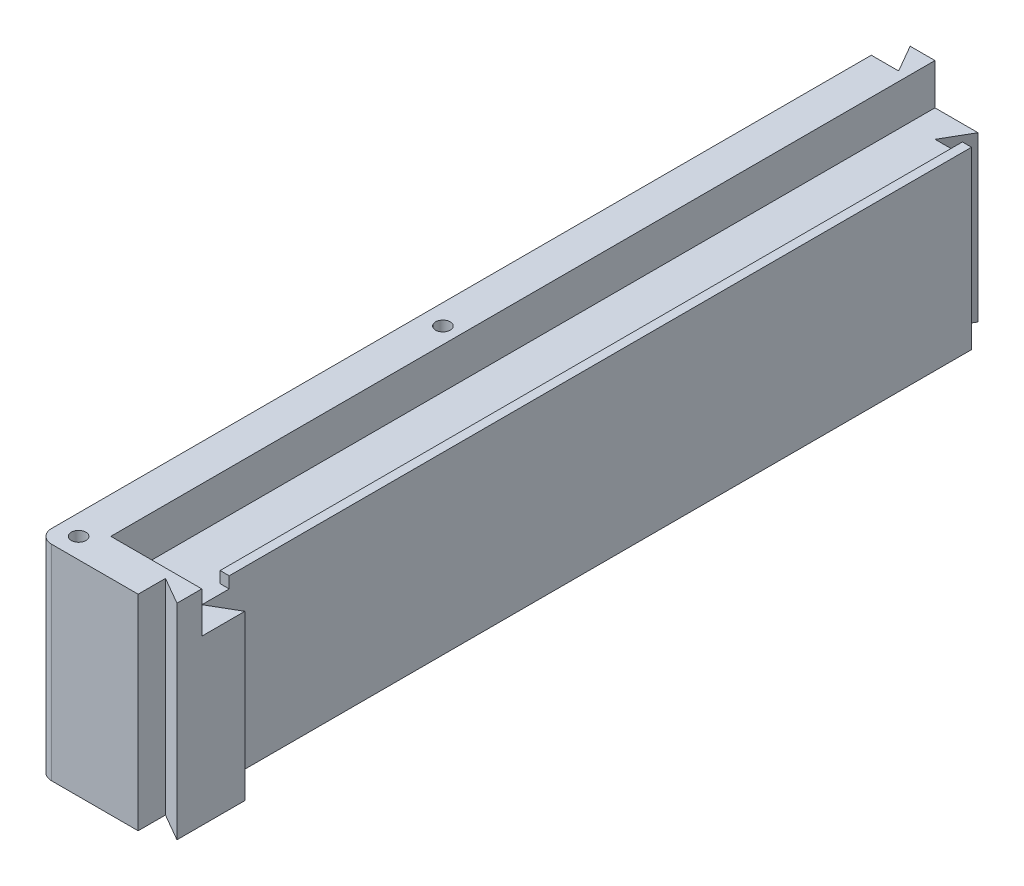
ISO-10303-21;
HEADER;
FILE_DESCRIPTION(('STEP AP214'),'2;1');
FILE_NAME('part.step','',(''),(''),'','','');
FILE_SCHEMA(('AUTOMOTIVE_DESIGN { 1 0 10303 214 1 1 1 1 }'));
ENDSEC;
DATA;
#1=APPLICATION_CONTEXT('core data for automotive mechanical design processes');
#2=APPLICATION_PROTOCOL_DEFINITION('international standard','automotive_design',2000,#1);
#3=PRODUCT_CONTEXT('',#1,'mechanical');
#4=PRODUCT('Part','Part','',(#3));
#5=PRODUCT_RELATED_PRODUCT_CATEGORY('part','',(#4));
#6=PRODUCT_DEFINITION_FORMATION('','',#4);
#7=PRODUCT_DEFINITION_CONTEXT('part definition',#1,'design');
#8=PRODUCT_DEFINITION('design','',#6,#7);
#9=PRODUCT_DEFINITION_SHAPE('','',#8);
#10=(LENGTH_UNIT() NAMED_UNIT(*) SI_UNIT(.MILLI.,.METRE.));
#11=(NAMED_UNIT(*) PLANE_ANGLE_UNIT() SI_UNIT($,.RADIAN.));
#12=(NAMED_UNIT(*) SI_UNIT($,.STERADIAN.) SOLID_ANGLE_UNIT());
#13=UNCERTAINTY_MEASURE_WITH_UNIT(LENGTH_MEASURE(1.E-05),#10,'distance_accuracy_value','');
#14=(GEOMETRIC_REPRESENTATION_CONTEXT(3) GLOBAL_UNCERTAINTY_ASSIGNED_CONTEXT((#13)) GLOBAL_UNIT_ASSIGNED_CONTEXT((#10,
#11,#12)) REPRESENTATION_CONTEXT('',''));
#15=CARTESIAN_POINT('',(0.,0.,0.));
#16=DIRECTION('',(0.,0.,1.));
#17=DIRECTION('',(1.,0.,0.));
#18=AXIS2_PLACEMENT_3D('',#15,#16,#17);
#19=CARTESIAN_POINT('',(0.,0.,0.));
#20=DIRECTION('',(0.,1.,0.));
#21=DIRECTION('',(0.,0.,1.));
#22=AXIS2_PLACEMENT_3D('',#19,#20,#21);
#23=PLANE('',#22);
#24=CARTESIAN_POINT('',(-3.53553390593275,0.,3.53553390593275));
#25=DIRECTION('',(0.,1.,0.));
#26=DIRECTION('',(0.,0.,1.));
#27=AXIS2_PLACEMENT_3D('',#24,#25,#26);
#28=CIRCLE('',#27,1.6);
#29=CARTESIAN_POINT('',(-3.53553390593275,0.,5.13553390593275));
#30=VERTEX_POINT('',#29);
#31=EDGE_CURVE('E231',#30,#30,#28,.F.);
#32=ORIENTED_EDGE('',*,*,#31,.F.);
#33=EDGE_LOOP('',(#32));
#34=FACE_BOUND('',#33,.T.);
#35=CARTESIAN_POINT('',(-3.53553390593275,0.,-76.4644660940672));
#36=DIRECTION('',(0.,1.,0.));
#37=DIRECTION('',(0.,0.,1.));
#38=AXIS2_PLACEMENT_3D('',#35,#36,#37);
#39=CIRCLE('',#38,1.60000000000001);
#40=CARTESIAN_POINT('',(-3.53553390593275,0.,-74.8644660940672));
#41=VERTEX_POINT('',#40);
#42=EDGE_CURVE('E328',#41,#41,#39,.T.);
#43=ORIENTED_EDGE('',*,*,#42,.T.);
#44=EDGE_LOOP('',(#43));
#45=FACE_BOUND('',#44,.T.);
#46=DIRECTION('',(1.,0.,0.));
#47=VECTOR('',#46,1.);
#48=CARTESIAN_POINT('',(0.,0.,8.));
#49=LINE('',#48,#47);
#50=CARTESIAN_POINT('',(-5.,0.,8.));
#51=VERTEX_POINT('',#50);
#52=CARTESIAN_POINT('',(14.,0.,8.));
#53=VERTEX_POINT('',#52);
#54=EDGE_CURVE('E56',#51,#53,#49,.T.);
#55=ORIENTED_EDGE('',*,*,#54,.F.);
#56=CARTESIAN_POINT('',(-5.,0.,5.));
#57=DIRECTION('',(0.,1.,0.));
#58=DIRECTION('',(0.,0.,1.));
#59=AXIS2_PLACEMENT_3D('',#56,#57,#58);
#60=CIRCLE('',#59,3.);
#61=CARTESIAN_POINT('',(-8.,0.,5.));
#62=VERTEX_POINT('',#61);
#63=EDGE_CURVE('E331',#62,#51,#60,.T.);
#64=ORIENTED_EDGE('',*,*,#63,.F.);
#65=DIRECTION('',(0.,0.,1.));
#66=VECTOR('',#65,1.);
#67=CARTESIAN_POINT('',(-8.,0.,0.));
#68=LINE('',#67,#66);
#69=CARTESIAN_POINT('',(-8.,0.,-175.));
#70=VERTEX_POINT('',#69);
#71=EDGE_CURVE('E78',#70,#62,#68,.T.);
#72=ORIENTED_EDGE('',*,*,#71,.F.);
#73=DIRECTION('',(-1.,0.,0.));
#74=VECTOR('',#73,1.);
#75=CARTESIAN_POINT('',(-6.07153216591882E-13,0.,-175.));
#76=LINE('',#75,#74);
#77=CARTESIAN_POINT('',(-1.99999999999997,0.,-175.));
#78=VERTEX_POINT('',#77);
#79=EDGE_CURVE('E367',#78,#70,#76,.T.);
#80=ORIENTED_EDGE('',*,*,#79,.F.);
#81=DIRECTION('',(-0.499999999999998,0.,-0.86602540378444));
#82=VECTOR('',#81,1.);
#83=CARTESIAN_POINT('',(74.2772228311382,0.,-42.8839745962152));
#84=LINE('',#83,#82);
#85=CARTESIAN_POINT('',(-5.45,0.,-180.975575286113));
#86=VERTEX_POINT('',#85);
#87=EDGE_CURVE('E364',#78,#86,#84,.T.);
#88=ORIENTED_EDGE('',*,*,#87,.T.);
#89=DIRECTION('',(1.,0.,0.));
#90=VECTOR('',#89,1.);
#91=CARTESIAN_POINT('',(0.,0.,-180.975575286113));
#92=LINE('',#91,#90);
#93=CARTESIAN_POINT('',(9.45000000000001,0.,-180.975575286113));
#94=VERTEX_POINT('',#93);
#95=EDGE_CURVE('E361',#86,#94,#92,.T.);
#96=ORIENTED_EDGE('',*,*,#95,.T.);
#97=DIRECTION('',(-0.499999999999998,0.,0.86602540378444));
#98=VECTOR('',#97,1.);
#99=CARTESIAN_POINT('',(-71.2772228311381,0.,-41.1519237886463));
#100=LINE('',#99,#98);
#101=CARTESIAN_POINT('',(6.00000000000001,0.,-175.));
#102=VERTEX_POINT('',#101);
#103=EDGE_CURVE('E359',#94,#102,#100,.T.);
#104=ORIENTED_EDGE('',*,*,#103,.T.);
#105=CARTESIAN_POINT('',(14.,0.,-175.));
#106=VERTEX_POINT('',#105);
#107=EDGE_CURVE('E263',#106,#102,#76,.T.);
#108=ORIENTED_EDGE('',*,*,#107,.F.);
#109=DIRECTION('',(0.,0.,-1.));
#110=VECTOR('',#109,1.);
#111=CARTESIAN_POINT('',(14.,0.,-336.));
#112=LINE('',#111,#110);
#113=CARTESIAN_POINT('',(14.,0.,-6.));
#114=VERTEX_POINT('',#113);
#115=EDGE_CURVE('E305',#114,#106,#112,.T.);
#116=ORIENTED_EDGE('',*,*,#115,.F.);
#117=DIRECTION('',(-0.86602540378444,0.,0.499999999999997));
#118=VECTOR('',#117,1.);
#119=CARTESIAN_POINT('',(0.901923788646655,0.,1.56217782649103));
#120=LINE('',#119,#118);
#121=CARTESIAN_POINT('',(19.9755752861127,0.,-9.45));
#122=VERTEX_POINT('',#121);
#123=EDGE_CURVE('E272',#122,#114,#120,.T.);
#124=ORIENTED_EDGE('',*,*,#123,.F.);
#125=DIRECTION('',(0.,0.,-1.));
#126=VECTOR('',#125,1.);
#127=CARTESIAN_POINT('',(19.9755752861127,0.,0.));
#128=LINE('',#127,#126);
#129=CARTESIAN_POINT('',(19.9755752861127,0.,5.45000000000001));
#130=VERTEX_POINT('',#129);
#131=EDGE_CURVE('E183',#130,#122,#128,.T.);
#132=ORIENTED_EDGE('',*,*,#131,.F.);
#133=DIRECTION('',(0.86602540378444,0.,0.499999999999998));
#134=VECTOR('',#133,1.);
#135=CARTESIAN_POINT('',(2.63397459621554,0.,-4.56217782649105));
#136=LINE('',#135,#134);
#137=CARTESIAN_POINT('',(14.,0.,2.));
#138=VERTEX_POINT('',#137);
#139=EDGE_CURVE('E371',#138,#130,#136,.T.);
#140=ORIENTED_EDGE('',*,*,#139,.F.);
#141=DIRECTION('',(0.,0.,1.));
#142=VECTOR('',#141,1.);
#143=CARTESIAN_POINT('',(14.,0.,0.));
#144=LINE('',#143,#142);
#145=EDGE_CURVE('E334',#138,#53,#144,.T.);
#146=ORIENTED_EDGE('',*,*,#145,.T.);
#147=EDGE_LOOP('',(#55,#64,#72,#80,#88,#96,#104,#108,#116,#124,#132,#140,#146));
#148=FACE_BOUND('',#147,.T.);
#149=ADVANCED_FACE('F39',(#34,#45,#148),#23,.F.);
#150=CARTESIAN_POINT('',(0.,45.,0.));
#151=DIRECTION('',(0.,1.,0.));
#152=DIRECTION('',(0.,0.,1.));
#153=AXIS2_PLACEMENT_3D('',#150,#151,#152);
#154=PLANE('',#153);
#155=CARTESIAN_POINT('',(-3.53553390593275,45.,-76.4644660940672));
#156=DIRECTION('',(0.,1.,0.));
#157=DIRECTION('',(0.,0.,1.));
#158=AXIS2_PLACEMENT_3D('',#155,#156,#157);
#159=CIRCLE('',#158,1.60000000000001);
#160=CARTESIAN_POINT('',(-3.53553390593275,45.,-74.8644660940672));
#161=VERTEX_POINT('',#160);
#162=EDGE_CURVE('E355',#161,#161,#159,.T.);
#163=ORIENTED_EDGE('',*,*,#162,.F.);
#164=EDGE_LOOP('',(#163));
#165=FACE_BOUND('',#164,.T.);
#166=CARTESIAN_POINT('',(-3.53553390593275,45.,3.53553390593275));
#167=DIRECTION('',(0.,1.,0.));
#168=DIRECTION('',(0.,0.,1.));
#169=AXIS2_PLACEMENT_3D('',#166,#167,#168);
#170=CIRCLE('',#169,1.6);
#171=CARTESIAN_POINT('',(-3.53553390593275,45.,5.13553390593275));
#172=VERTEX_POINT('',#171);
#173=EDGE_CURVE('E228',#172,#172,#170,.F.);
#174=ORIENTED_EDGE('',*,*,#173,.T.);
#175=EDGE_LOOP('',(#174));
#176=FACE_BOUND('',#175,.T.);
#177=CARTESIAN_POINT('',(-5.,45.,5.));
#178=DIRECTION('',(0.,1.,0.));
#179=DIRECTION('',(0.,0.,1.));
#180=AXIS2_PLACEMENT_3D('',#177,#178,#179);
#181=CIRCLE('',#180,3.);
#182=CARTESIAN_POINT('',(-8.,45.,5.));
#183=VERTEX_POINT('',#182);
#184=CARTESIAN_POINT('',(-5.,45.,8.));
#185=VERTEX_POINT('',#184);
#186=EDGE_CURVE('E11',#183,#185,#181,.T.);
#187=ORIENTED_EDGE('',*,*,#186,.T.);
#188=DIRECTION('',(1.,0.,0.));
#189=VECTOR('',#188,1.);
#190=CARTESIAN_POINT('',(0.,45.,8.));
#191=LINE('',#190,#189);
#192=CARTESIAN_POINT('',(14.,45.,8.));
#193=VERTEX_POINT('',#192);
#194=EDGE_CURVE('E71',#185,#193,#191,.T.);
#195=ORIENTED_EDGE('',*,*,#194,.T.);
#196=DIRECTION('',(0.,0.,-1.));
#197=VECTOR('',#196,1.);
#198=CARTESIAN_POINT('',(14.,45.,0.));
#199=LINE('',#198,#197);
#200=CARTESIAN_POINT('',(14.,45.,2.));
#201=VERTEX_POINT('',#200);
#202=EDGE_CURVE('E298',#193,#201,#199,.T.);
#203=ORIENTED_EDGE('',*,*,#202,.T.);
#204=DIRECTION('',(-0.86602540378444,0.,-0.499999999999998));
#205=VECTOR('',#204,1.);
#206=CARTESIAN_POINT('',(2.63397459621554,45.,-4.56217782649105));
#207=LINE('',#206,#205);
#208=CARTESIAN_POINT('',(19.9755752861127,45.,5.45000000000001));
#209=VERTEX_POINT('',#208);
#210=EDGE_CURVE('E303',#209,#201,#207,.T.);
#211=ORIENTED_EDGE('',*,*,#210,.F.);
#212=DIRECTION('',(0.,0.,1.));
#213=VECTOR('',#212,1.);
#214=CARTESIAN_POINT('',(19.9755752861127,45.,0.));
#215=LINE('',#214,#213);
#216=CARTESIAN_POINT('',(19.9755752861127,45.,0.));
#217=VERTEX_POINT('',#216);
#218=EDGE_CURVE('E288',#217,#209,#215,.T.);
#219=ORIENTED_EDGE('',*,*,#218,.F.);
#220=DIRECTION('',(1.,0.,0.));
#221=VECTOR('',#220,1.);
#222=CARTESIAN_POINT('',(0.,45.,0.));
#223=LINE('',#222,#221);
#224=CARTESIAN_POINT('',(0.,45.,0.));
#225=VERTEX_POINT('',#224);
#226=EDGE_CURVE('E236',#225,#217,#223,.T.);
#227=ORIENTED_EDGE('',*,*,#226,.F.);
#228=DIRECTION('',(0.,0.,-1.));
#229=VECTOR('',#228,1.);
#230=CARTESIAN_POINT('',(0.,45.,0.));
#231=LINE('',#230,#229);
#232=CARTESIAN_POINT('',(0.,45.,-180.975575286113));
#233=VERTEX_POINT('',#232);
#234=EDGE_CURVE('E239',#225,#233,#231,.T.);
#235=ORIENTED_EDGE('',*,*,#234,.T.);
#236=DIRECTION('',(-1.,0.,0.));
#237=VECTOR('',#236,1.);
#238=CARTESIAN_POINT('',(0.,45.,-180.975575286113));
#239=LINE('',#238,#237);
#240=CARTESIAN_POINT('',(-5.45,45.,-180.975575286113));
#241=VERTEX_POINT('',#240);
#242=EDGE_CURVE('E268',#233,#241,#239,.T.);
#243=ORIENTED_EDGE('',*,*,#242,.T.);
#244=DIRECTION('',(0.499999999999998,0.,0.86602540378444));
#245=VECTOR('',#244,1.);
#246=CARTESIAN_POINT('',(74.2772228311382,45.,-42.8839745962152));
#247=LINE('',#246,#245);
#248=CARTESIAN_POINT('',(-1.99999999999997,45.,-175.));
#249=VERTEX_POINT('',#248);
#250=EDGE_CURVE('E300',#241,#249,#247,.T.);
#251=ORIENTED_EDGE('',*,*,#250,.T.);
#252=DIRECTION('',(1.,0.,0.));
#253=VECTOR('',#252,1.);
#254=CARTESIAN_POINT('',(-6.07153216591882E-13,45.,-175.));
#255=LINE('',#254,#253);
#256=CARTESIAN_POINT('',(-8.,45.,-175.));
#257=VERTEX_POINT('',#256);
#258=EDGE_CURVE('E296',#257,#249,#255,.T.);
#259=ORIENTED_EDGE('',*,*,#258,.F.);
#260=DIRECTION('',(0.,0.,1.));
#261=VECTOR('',#260,1.);
#262=CARTESIAN_POINT('',(-8.,45.,0.));
#263=LINE('',#262,#261);
#264=EDGE_CURVE('E349',#257,#183,#263,.T.);
#265=ORIENTED_EDGE('',*,*,#264,.T.);
#266=EDGE_LOOP('',(#187,#195,#203,#211,#219,#227,#235,#243,#251,#259,#265));
#267=FACE_BOUND('',#266,.T.);
#268=ADVANCED_FACE('F311',(#165,#176,#267),#154,.T.);
#269=CARTESIAN_POINT('',(-6.07153216591882E-13,126.5,-175.));
#270=DIRECTION('',(0.,0.,1.));
#271=DIRECTION('',(1.,0.,0.));
#272=AXIS2_PLACEMENT_3D('',#269,#270,#271);
#273=PLANE('',#272);
#274=DIRECTION('',(0.,1.,0.));
#275=VECTOR('',#274,1.);
#276=CARTESIAN_POINT('',(-8.,0.,-175.));
#277=LINE('',#276,#275);
#278=EDGE_CURVE('E337',#70,#257,#277,.T.);
#279=ORIENTED_EDGE('',*,*,#278,.T.);
#280=ORIENTED_EDGE('',*,*,#258,.T.);
#281=DIRECTION('',(0.,-1.,0.));
#282=VECTOR('',#281,1.);
#283=CARTESIAN_POINT('',(-1.99999999999997,126.5,-175.));
#284=LINE('',#283,#282);
#285=EDGE_CURVE('E279',#249,#78,#284,.T.);
#286=ORIENTED_EDGE('',*,*,#285,.T.);
#287=ORIENTED_EDGE('',*,*,#79,.T.);
#288=EDGE_LOOP('',(#279,#280,#286,#287));
#289=FACE_BOUND('',#288,.T.);
#290=ADVANCED_FACE('F390',(#289),#273,.F.);
#291=CARTESIAN_POINT('',(14.,126.5,0.));
#292=DIRECTION('',(1.,0.,0.));
#293=DIRECTION('',(0.,0.,-1.));
#294=AXIS2_PLACEMENT_3D('',#291,#292,#293);
#295=PLANE('',#294);
#296=ORIENTED_EDGE('',*,*,#202,.F.);
#297=DIRECTION('',(0.,1.,0.));
#298=VECTOR('',#297,1.);
#299=CARTESIAN_POINT('',(14.,0.,8.));
#300=LINE('',#299,#298);
#301=EDGE_CURVE('E342',#53,#193,#300,.T.);
#302=ORIENTED_EDGE('',*,*,#301,.F.);
#303=ORIENTED_EDGE('',*,*,#145,.F.);
#304=DIRECTION('',(0.,-1.,0.));
#305=VECTOR('',#304,1.);
#306=CARTESIAN_POINT('',(14.,126.5,2.));
#307=LINE('',#306,#305);
#308=EDGE_CURVE('E277',#201,#138,#307,.T.);
#309=ORIENTED_EDGE('',*,*,#308,.F.);
#310=EDGE_LOOP('',(#296,#302,#303,#309));
#311=FACE_BOUND('',#310,.T.);
#312=ADVANCED_FACE('F394',(#311),#295,.T.);
#313=CARTESIAN_POINT('',(0.,45.,0.));
#314=DIRECTION('',(-1.,0.,0.));
#315=DIRECTION('',(0.,0.,1.));
#316=AXIS2_PLACEMENT_3D('',#313,#314,#315);
#317=PLANE('',#316);
#318=DIRECTION('',(0.,-1.,0.));
#319=VECTOR('',#318,1.);
#320=CARTESIAN_POINT('',(0.,45.,-180.975575286113));
#321=LINE('',#320,#319);
#322=CARTESIAN_POINT('',(0.,36.,-180.975575286113));
#323=VERTEX_POINT('',#322);
#324=EDGE_CURVE('E265',#233,#323,#321,.T.);
#325=ORIENTED_EDGE('',*,*,#324,.F.);
#326=ORIENTED_EDGE('',*,*,#234,.F.);
#327=DIRECTION('',(0.,-1.,0.));
#328=VECTOR('',#327,1.);
#329=CARTESIAN_POINT('',(0.,45.,0.));
#330=LINE('',#329,#328);
#331=CARTESIAN_POINT('',(0.,36.,0.));
#332=VERTEX_POINT('',#331);
#333=EDGE_CURVE('E242',#225,#332,#330,.T.);
#334=ORIENTED_EDGE('',*,*,#333,.T.);
#335=DIRECTION('',(0.,0.,1.));
#336=VECTOR('',#335,1.);
#337=CARTESIAN_POINT('',(0.,36.,-180.975575286113));
#338=LINE('',#337,#336);
#339=EDGE_CURVE('E352',#323,#332,#338,.T.);
#340=ORIENTED_EDGE('',*,*,#339,.F.);
#341=EDGE_LOOP('',(#325,#326,#334,#340));
#342=FACE_BOUND('',#341,.T.);
#343=ADVANCED_FACE('F392',(#342),#317,.F.);
#344=CARTESIAN_POINT('',(0.,36.,-12.));
#345=DIRECTION('',(0.,0.,1.));
#346=DIRECTION('',(1.,0.,0.));
#347=AXIS2_PLACEMENT_3D('',#344,#345,#346);
#348=PLANE('',#347);
#349=DIRECTION('',(1.,0.,0.));
#350=VECTOR('',#349,1.);
#351=CARTESIAN_POINT('',(0.,36.,-12.));
#352=LINE('',#351,#350);
#353=CARTESIAN_POINT('',(12.,36.,-12.));
#354=VERTEX_POINT('',#353);
#355=CARTESIAN_POINT('',(14.,36.,-12.));
#356=VERTEX_POINT('',#355);
#357=EDGE_CURVE('E210',#354,#356,#352,.T.);
#358=ORIENTED_EDGE('',*,*,#357,.T.);
#359=DIRECTION('',(0.,1.,0.));
#360=VECTOR('',#359,1.);
#361=CARTESIAN_POINT('',(14.,36.,-12.));
#362=LINE('',#361,#360);
#363=CARTESIAN_POINT('',(14.,38.5,-12.));
#364=VERTEX_POINT('',#363);
#365=EDGE_CURVE('E217',#356,#364,#362,.T.);
#366=ORIENTED_EDGE('',*,*,#365,.T.);
#367=DIRECTION('',(1.,0.,0.));
#368=VECTOR('',#367,1.);
#369=CARTESIAN_POINT('',(0.,38.5,-12.));
#370=LINE('',#369,#368);
#371=CARTESIAN_POINT('',(12.,38.5,-12.));
#372=VERTEX_POINT('',#371);
#373=EDGE_CURVE('E225',#372,#364,#370,.T.);
#374=ORIENTED_EDGE('',*,*,#373,.F.);
#375=DIRECTION('',(0.,1.,0.));
#376=VECTOR('',#375,1.);
#377=CARTESIAN_POINT('',(12.,36.,-12.));
#378=LINE('',#377,#376);
#379=EDGE_CURVE('E220',#354,#372,#378,.T.);
#380=ORIENTED_EDGE('',*,*,#379,.F.);
#381=EDGE_LOOP('',(#358,#366,#374,#380));
#382=FACE_BOUND('',#381,.T.);
#383=ADVANCED_FACE('F215',(#382),#348,.T.);
#384=CARTESIAN_POINT('',(0.,36.,0.));
#385=DIRECTION('',(0.,1.,0.));
#386=DIRECTION('',(0.,0.,1.));
#387=AXIS2_PLACEMENT_3D('',#384,#385,#386);
#388=PLANE('',#387);
#389=DIRECTION('',(0.86602540378444,0.,-0.499999999999997));
#390=VECTOR('',#389,1.);
#391=CARTESIAN_POINT('',(0.901923788646655,36.,1.56217782649103));
#392=LINE('',#391,#390);
#393=CARTESIAN_POINT('',(14.,36.,-6.));
#394=VERTEX_POINT('',#393);
#395=CARTESIAN_POINT('',(19.9755752861127,36.,-9.45));
#396=VERTEX_POINT('',#395);
#397=EDGE_CURVE('E192',#394,#396,#392,.T.);
#398=ORIENTED_EDGE('',*,*,#397,.F.);
#399=DIRECTION('',(0.,0.,-1.));
#400=VECTOR('',#399,1.);
#401=CARTESIAN_POINT('',(14.,36.,0.));
#402=LINE('',#401,#400);
#403=EDGE_CURVE('E48',#394,#356,#402,.T.);
#404=ORIENTED_EDGE('',*,*,#403,.T.);
#405=ORIENTED_EDGE('',*,*,#357,.F.);
#406=DIRECTION('',(0.,0.,1.));
#407=VECTOR('',#406,1.);
#408=CARTESIAN_POINT('',(12.,36.,0.));
#409=LINE('',#408,#407);
#410=CARTESIAN_POINT('',(12.,36.,-175.));
#411=VERTEX_POINT('',#410);
#412=EDGE_CURVE('E221',#411,#354,#409,.T.);
#413=ORIENTED_EDGE('',*,*,#412,.F.);
#414=DIRECTION('',(1.,0.,0.));
#415=VECTOR('',#414,1.);
#416=CARTESIAN_POINT('',(-6.07153216591882E-13,36.,-175.));
#417=LINE('',#416,#415);
#418=CARTESIAN_POINT('',(6.00000000000001,36.,-175.));
#419=VERTEX_POINT('',#418);
#420=EDGE_CURVE('E202',#419,#411,#417,.T.);
#421=ORIENTED_EDGE('',*,*,#420,.F.);
#422=DIRECTION('',(0.499999999999998,0.,-0.86602540378444));
#423=VECTOR('',#422,1.);
#424=CARTESIAN_POINT('',(-71.2772228311381,36.,-41.1519237886463));
#425=LINE('',#424,#423);
#426=CARTESIAN_POINT('',(9.45000000000001,36.,-180.975575286113));
#427=VERTEX_POINT('',#426);
#428=EDGE_CURVE('E204',#419,#427,#425,.T.);
#429=ORIENTED_EDGE('',*,*,#428,.T.);
#430=DIRECTION('',(-1.,0.,0.));
#431=VECTOR('',#430,1.);
#432=CARTESIAN_POINT('',(0.,36.,-180.975575286113));
#433=LINE('',#432,#431);
#434=EDGE_CURVE('E244',#427,#323,#433,.T.);
#435=ORIENTED_EDGE('',*,*,#434,.T.);
#436=ORIENTED_EDGE('',*,*,#339,.T.);
#437=DIRECTION('',(1.,0.,0.));
#438=VECTOR('',#437,1.);
#439=CARTESIAN_POINT('',(0.,36.,0.));
#440=LINE('',#439,#438);
#441=CARTESIAN_POINT('',(19.9755752861127,36.,0.));
#442=VERTEX_POINT('',#441);
#443=EDGE_CURVE('E201',#332,#442,#440,.T.);
#444=ORIENTED_EDGE('',*,*,#443,.T.);
#445=DIRECTION('',(0.,0.,1.));
#446=VECTOR('',#445,1.);
#447=CARTESIAN_POINT('',(19.9755752861127,36.,0.));
#448=LINE('',#447,#446);
#449=EDGE_CURVE('E180',#396,#442,#448,.T.);
#450=ORIENTED_EDGE('',*,*,#449,.F.);
#451=EDGE_LOOP('',(#398,#404,#405,#413,#421,#429,#435,#436,#444,#450));
#452=FACE_BOUND('',#451,.T.);
#453=ADVANCED_FACE('F198',(#452),#388,.T.);
#454=CARTESIAN_POINT('',(0.,38.5,0.));
#455=DIRECTION('',(0.,-1.,0.));
#456=DIRECTION('',(0.,0.,-1.));
#457=AXIS2_PLACEMENT_3D('',#454,#455,#456);
#458=PLANE('',#457);
#459=DIRECTION('',(0.,0.,1.));
#460=VECTOR('',#459,1.);
#461=CARTESIAN_POINT('',(14.,38.5,-14.));
#462=LINE('',#461,#460);
#463=CARTESIAN_POINT('',(14.,38.5,-175.));
#464=VERTEX_POINT('',#463);
#465=EDGE_CURVE('E234',#464,#364,#462,.T.);
#466=ORIENTED_EDGE('',*,*,#465,.F.);
#467=DIRECTION('',(-1.,0.,0.));
#468=VECTOR('',#467,1.);
#469=CARTESIAN_POINT('',(-6.07153216591882E-13,38.5,-175.));
#470=LINE('',#469,#468);
#471=CARTESIAN_POINT('',(12.,38.5,-175.));
#472=VERTEX_POINT('',#471);
#473=EDGE_CURVE('E293',#464,#472,#470,.T.);
#474=ORIENTED_EDGE('',*,*,#473,.T.);
#475=DIRECTION('',(0.,0.,1.));
#476=VECTOR('',#475,1.);
#477=CARTESIAN_POINT('',(12.,38.5,0.));
#478=LINE('',#477,#476);
#479=EDGE_CURVE('E222',#472,#372,#478,.T.);
#480=ORIENTED_EDGE('',*,*,#479,.T.);
#481=ORIENTED_EDGE('',*,*,#373,.T.);
#482=EDGE_LOOP('',(#466,#474,#480,#481));
#483=FACE_BOUND('',#482,.T.);
#484=ADVANCED_FACE('F382',(#483),#458,.F.);
#485=CARTESIAN_POINT('',(0.,45.,0.));
#486=DIRECTION('',(0.,0.,-1.));
#487=DIRECTION('',(-1.,0.,0.));
#488=AXIS2_PLACEMENT_3D('',#485,#486,#487);
#489=PLANE('',#488);
#490=DIRECTION('',(0.,1.,0.));
#491=VECTOR('',#490,1.);
#492=CARTESIAN_POINT('',(19.9755752861127,45.,0.));
#493=LINE('',#492,#491);
#494=EDGE_CURVE('E286',#442,#217,#493,.T.);
#495=ORIENTED_EDGE('',*,*,#494,.F.);
#496=ORIENTED_EDGE('',*,*,#443,.F.);
#497=ORIENTED_EDGE('',*,*,#333,.F.);
#498=ORIENTED_EDGE('',*,*,#226,.T.);
#499=EDGE_LOOP('',(#495,#496,#497,#498));
#500=FACE_BOUND('',#499,.T.);
#501=ADVANCED_FACE('F41',(#500),#489,.T.);
#502=CARTESIAN_POINT('',(14.,33.5,-14.));
#503=DIRECTION('',(-1.,0.,0.));
#504=DIRECTION('',(0.,0.,1.));
#505=AXIS2_PLACEMENT_3D('',#502,#503,#504);
#506=PLANE('',#505);
#507=ORIENTED_EDGE('',*,*,#115,.T.);
#508=DIRECTION('',(0.,-1.,0.));
#509=VECTOR('',#508,1.);
#510=CARTESIAN_POINT('',(14.,126.5,-175.));
#511=LINE('',#510,#509);
#512=EDGE_CURVE('E266',#464,#106,#511,.T.);
#513=ORIENTED_EDGE('',*,*,#512,.F.);
#514=ORIENTED_EDGE('',*,*,#465,.T.);
#515=ORIENTED_EDGE('',*,*,#365,.F.);
#516=ORIENTED_EDGE('',*,*,#403,.F.);
#517=DIRECTION('',(0.,-1.,0.));
#518=VECTOR('',#517,1.);
#519=CARTESIAN_POINT('',(14.,126.5,-6.));
#520=LINE('',#519,#518);
#521=EDGE_CURVE('E187',#394,#114,#520,.T.);
#522=ORIENTED_EDGE('',*,*,#521,.T.);
#523=EDGE_LOOP('',(#507,#513,#514,#515,#516,#522));
#524=FACE_BOUND('',#523,.T.);
#525=ADVANCED_FACE('F373',(#524),#506,.F.);
#526=CARTESIAN_POINT('',(12.,36.,0.));
#527=DIRECTION('',(-1.,0.,0.));
#528=DIRECTION('',(0.,0.,1.));
#529=AXIS2_PLACEMENT_3D('',#526,#527,#528);
#530=PLANE('',#529);
#531=DIRECTION('',(0.,1.,0.));
#532=VECTOR('',#531,1.);
#533=CARTESIAN_POINT('',(12.,36.,-175.));
#534=LINE('',#533,#532);
#535=EDGE_CURVE('E291',#411,#472,#534,.T.);
#536=ORIENTED_EDGE('',*,*,#535,.F.);
#537=ORIENTED_EDGE('',*,*,#412,.T.);
#538=ORIENTED_EDGE('',*,*,#379,.T.);
#539=ORIENTED_EDGE('',*,*,#479,.F.);
#540=EDGE_LOOP('',(#536,#537,#538,#539));
#541=FACE_BOUND('',#540,.T.);
#542=ADVANCED_FACE('F318',(#541),#530,.T.);
#543=CARTESIAN_POINT('',(-3.53553390593275,-64.5,3.53553390593275));
#544=DIRECTION('',(0.,1.,0.));
#545=DIRECTION('',(0.,0.,1.));
#546=AXIS2_PLACEMENT_3D('',#543,#544,#545);
#547=CYLINDRICAL_SURFACE('',#546,1.6);
#548=ORIENTED_EDGE('',*,*,#173,.F.);
#549=EDGE_LOOP('',(#548));
#550=FACE_BOUND('',#549,.T.);
#551=ORIENTED_EDGE('',*,*,#31,.T.);
#552=EDGE_LOOP('',(#551));
#553=FACE_BOUND('',#552,.T.);
#554=ADVANCED_FACE('F314',(#550,#553),#547,.F.);
#555=CARTESIAN_POINT('',(0.,126.5,-180.975575286113));
#556=DIRECTION('',(0.,0.,-1.));
#557=DIRECTION('',(-1.,0.,0.));
#558=AXIS2_PLACEMENT_3D('',#555,#556,#557);
#559=PLANE('',#558);
#560=ORIENTED_EDGE('',*,*,#324,.T.);
#561=ORIENTED_EDGE('',*,*,#434,.F.);
#562=DIRECTION('',(0.,-1.,0.));
#563=VECTOR('',#562,1.);
#564=CARTESIAN_POINT('',(9.45000000000001,126.5,-180.975575286113));
#565=LINE('',#564,#563);
#566=EDGE_CURVE('E258',#427,#94,#565,.T.);
#567=ORIENTED_EDGE('',*,*,#566,.T.);
#568=ORIENTED_EDGE('',*,*,#95,.F.);
#569=DIRECTION('',(0.,-1.,0.));
#570=VECTOR('',#569,1.);
#571=CARTESIAN_POINT('',(-5.45,126.5,-180.975575286113));
#572=LINE('',#571,#570);
#573=EDGE_CURVE('E281',#241,#86,#572,.T.);
#574=ORIENTED_EDGE('',*,*,#573,.F.);
#575=ORIENTED_EDGE('',*,*,#242,.F.);
#576=EDGE_LOOP('',(#560,#561,#567,#568,#574,#575));
#577=FACE_BOUND('',#576,.T.);
#578=ADVANCED_FACE('F317',(#577),#559,.T.);
#579=ORIENTED_EDGE('',*,*,#512,.T.);
#580=ORIENTED_EDGE('',*,*,#107,.T.);
#581=DIRECTION('',(0.,-1.,0.));
#582=VECTOR('',#581,1.);
#583=CARTESIAN_POINT('',(6.00000000000001,126.5,-175.));
#584=LINE('',#583,#582);
#585=EDGE_CURVE('E256',#419,#102,#584,.T.);
#586=ORIENTED_EDGE('',*,*,#585,.F.);
#587=ORIENTED_EDGE('',*,*,#420,.T.);
#588=ORIENTED_EDGE('',*,*,#535,.T.);
#589=ORIENTED_EDGE('',*,*,#473,.F.);
#590=EDGE_LOOP('',(#579,#580,#586,#587,#588,#589));
#591=FACE_BOUND('',#590,.T.);
#592=ADVANCED_FACE('F260',(#591),#273,.F.);
#593=CARTESIAN_POINT('',(-71.2772228311381,126.5,-41.1519237886463));
#594=DIRECTION('',(0.86602540378444,0.,0.499999999999998));
#595=DIRECTION('',(0.499999999999998,0.,-0.86602540378444));
#596=AXIS2_PLACEMENT_3D('',#593,#594,#595);
#597=PLANE('',#596);
#598=ORIENTED_EDGE('',*,*,#585,.T.);
#599=ORIENTED_EDGE('',*,*,#103,.F.);
#600=ORIENTED_EDGE('',*,*,#566,.F.);
#601=ORIENTED_EDGE('',*,*,#428,.F.);
#602=EDGE_LOOP('',(#598,#599,#600,#601));
#603=FACE_BOUND('',#602,.T.);
#604=ADVANCED_FACE('F254',(#603),#597,.T.);
#605=CARTESIAN_POINT('',(74.2772228311382,126.5,-42.8839745962152));
#606=DIRECTION('',(-0.86602540378444,0.,0.499999999999998));
#607=DIRECTION('',(0.499999999999998,0.,0.86602540378444));
#608=AXIS2_PLACEMENT_3D('',#605,#606,#607);
#609=PLANE('',#608);
#610=ORIENTED_EDGE('',*,*,#573,.T.);
#611=ORIENTED_EDGE('',*,*,#87,.F.);
#612=ORIENTED_EDGE('',*,*,#285,.F.);
#613=ORIENTED_EDGE('',*,*,#250,.F.);
#614=EDGE_LOOP('',(#610,#611,#612,#613));
#615=FACE_BOUND('',#614,.T.);
#616=ADVANCED_FACE('F433',(#615),#609,.T.);
#617=CARTESIAN_POINT('',(0.901923788646655,126.5,1.56217782649103));
#618=DIRECTION('',(0.499999999999997,0.,0.86602540378444));
#619=DIRECTION('',(0.86602540378444,0.,-0.499999999999997));
#620=AXIS2_PLACEMENT_3D('',#617,#618,#619);
#621=PLANE('',#620);
#622=ORIENTED_EDGE('',*,*,#397,.T.);
#623=DIRECTION('',(0.,-1.,0.));
#624=VECTOR('',#623,1.);
#625=CARTESIAN_POINT('',(19.9755752861127,126.5,-9.45));
#626=LINE('',#625,#624);
#627=EDGE_CURVE('E176',#396,#122,#626,.T.);
#628=ORIENTED_EDGE('',*,*,#627,.T.);
#629=ORIENTED_EDGE('',*,*,#123,.T.);
#630=ORIENTED_EDGE('',*,*,#521,.F.);
#631=EDGE_LOOP('',(#622,#628,#629,#630));
#632=FACE_BOUND('',#631,.T.);
#633=ADVANCED_FACE('F193',(#632),#621,.F.);
#634=CARTESIAN_POINT('',(19.9755752861127,126.5,0.));
#635=DIRECTION('',(-1.,0.,0.));
#636=DIRECTION('',(0.,0.,1.));
#637=AXIS2_PLACEMENT_3D('',#634,#635,#636);
#638=PLANE('',#637);
#639=ORIENTED_EDGE('',*,*,#449,.T.);
#640=ORIENTED_EDGE('',*,*,#494,.T.);
#641=ORIENTED_EDGE('',*,*,#218,.T.);
#642=DIRECTION('',(0.,-1.,0.));
#643=VECTOR('',#642,1.);
#644=CARTESIAN_POINT('',(19.9755752861127,126.5,5.45000000000001));
#645=LINE('',#644,#643);
#646=EDGE_CURVE('E188',#209,#130,#645,.T.);
#647=ORIENTED_EDGE('',*,*,#646,.T.);
#648=ORIENTED_EDGE('',*,*,#131,.T.);
#649=ORIENTED_EDGE('',*,*,#627,.F.);
#650=EDGE_LOOP('',(#639,#640,#641,#647,#648,#649));
#651=FACE_BOUND('',#650,.T.);
#652=ADVANCED_FACE('F178',(#651),#638,.F.);
#653=CARTESIAN_POINT('',(2.63397459621554,126.5,-4.56217782649105));
#654=DIRECTION('',(0.499999999999998,0.,-0.86602540378444));
#655=DIRECTION('',(-0.86602540378444,0.,-0.499999999999998));
#656=AXIS2_PLACEMENT_3D('',#653,#654,#655);
#657=PLANE('',#656);
#658=ORIENTED_EDGE('',*,*,#210,.T.);
#659=ORIENTED_EDGE('',*,*,#308,.T.);
#660=ORIENTED_EDGE('',*,*,#139,.T.);
#661=ORIENTED_EDGE('',*,*,#646,.F.);
#662=EDGE_LOOP('',(#658,#659,#660,#661));
#663=FACE_BOUND('',#662,.T.);
#664=ADVANCED_FACE('F410',(#663),#657,.F.);
#665=CARTESIAN_POINT('',(-3.53553390593275,-5.,-76.4644660940672));
#666=DIRECTION('',(0.,1.,0.));
#667=DIRECTION('',(0.,0.,1.));
#668=AXIS2_PLACEMENT_3D('',#665,#666,#667);
#669=CYLINDRICAL_SURFACE('',#668,1.60000000000001);
#670=ORIENTED_EDGE('',*,*,#162,.T.);
#671=EDGE_LOOP('',(#670));
#672=FACE_BOUND('',#671,.T.);
#673=ORIENTED_EDGE('',*,*,#42,.F.);
#674=EDGE_LOOP('',(#673));
#675=FACE_BOUND('',#674,.T.);
#676=ADVANCED_FACE('F423',(#672,#675),#669,.F.);
#677=CARTESIAN_POINT('',(-5.,0.,5.));
#678=DIRECTION('',(0.,1.,0.));
#679=DIRECTION('',(0.,0.,1.));
#680=AXIS2_PLACEMENT_3D('',#677,#678,#679);
#681=CYLINDRICAL_SURFACE('',#680,3.);
#682=DIRECTION('',(0.,1.,0.));
#683=VECTOR('',#682,1.);
#684=CARTESIAN_POINT('',(-8.,0.,5.));
#685=LINE('',#684,#683);
#686=EDGE_CURVE('E335',#62,#183,#685,.T.);
#687=ORIENTED_EDGE('',*,*,#686,.F.);
#688=ORIENTED_EDGE('',*,*,#63,.T.);
#689=DIRECTION('',(0.,1.,0.));
#690=VECTOR('',#689,1.);
#691=CARTESIAN_POINT('',(-5.,0.,8.));
#692=LINE('',#691,#690);
#693=EDGE_CURVE('E344',#51,#185,#692,.T.);
#694=ORIENTED_EDGE('',*,*,#693,.T.);
#695=ORIENTED_EDGE('',*,*,#186,.F.);
#696=EDGE_LOOP('',(#687,#688,#694,#695));
#697=FACE_BOUND('',#696,.T.);
#698=ADVANCED_FACE('F416',(#697),#681,.T.);
#699=CARTESIAN_POINT('',(0.,0.,8.));
#700=DIRECTION('',(0.,0.,1.));
#701=DIRECTION('',(1.,0.,0.));
#702=AXIS2_PLACEMENT_3D('',#699,#700,#701);
#703=PLANE('',#702);
#704=ORIENTED_EDGE('',*,*,#693,.F.);
#705=ORIENTED_EDGE('',*,*,#54,.T.);
#706=ORIENTED_EDGE('',*,*,#301,.T.);
#707=ORIENTED_EDGE('',*,*,#194,.F.);
#708=EDGE_LOOP('',(#704,#705,#706,#707));
#709=FACE_BOUND('',#708,.T.);
#710=ADVANCED_FACE('F413',(#709),#703,.T.);
#711=CARTESIAN_POINT('',(-8.,0.,0.));
#712=DIRECTION('',(-1.,0.,0.));
#713=DIRECTION('',(0.,0.,1.));
#714=AXIS2_PLACEMENT_3D('',#711,#712,#713);
#715=PLANE('',#714);
#716=ORIENTED_EDGE('',*,*,#278,.F.);
#717=ORIENTED_EDGE('',*,*,#71,.T.);
#718=ORIENTED_EDGE('',*,*,#686,.T.);
#719=ORIENTED_EDGE('',*,*,#264,.F.);
#720=EDGE_LOOP('',(#716,#717,#718,#719));
#721=FACE_BOUND('',#720,.T.);
#722=ADVANCED_FACE('F415',(#721),#715,.T.);
#723=CLOSED_SHELL('',(#149,#268,#290,#312,#343,#383,#453,#484,#501,#525,#542,#554,#578,#592,
#604,#616,#633,#652,#664,#676,#698,#710,#722));
#724=MANIFOLD_SOLID_BREP('B2',#723);
#725=ADVANCED_BREP_SHAPE_REPRESENTATION('',(#18,#724),#14);
#726=SHAPE_DEFINITION_REPRESENTATION(#9,#725);
ENDSEC;
END-ISO-10303-21;
